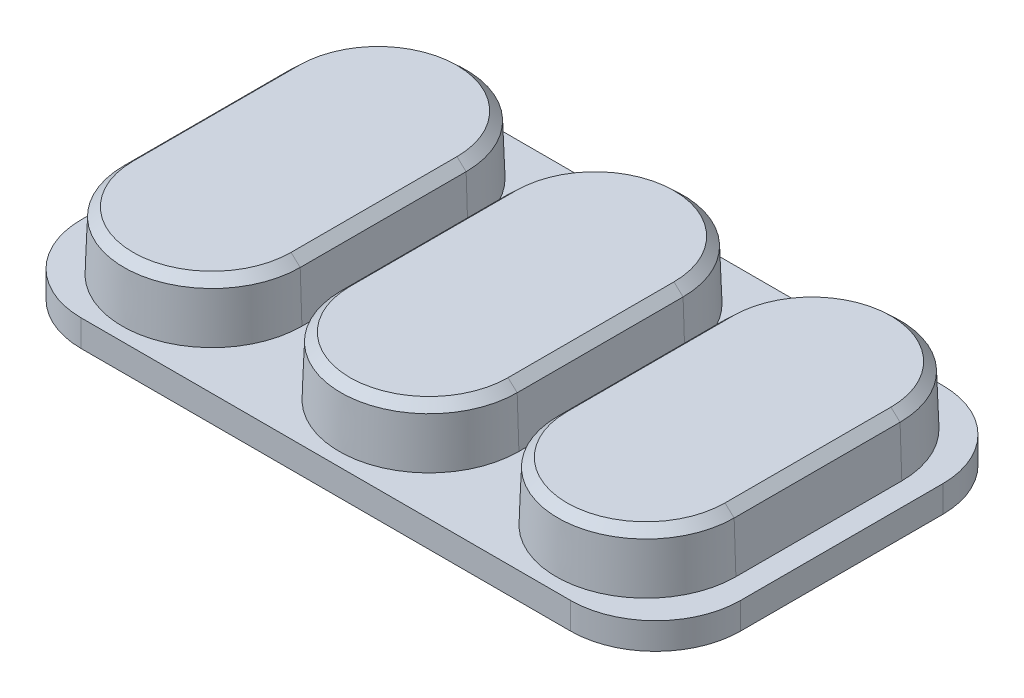
ISO-10303-21;
HEADER;
FILE_DESCRIPTION(('STEP AP214'),'2;1');
FILE_NAME('part.step','',(''),(''),'','','');
FILE_SCHEMA(('AUTOMOTIVE_DESIGN { 1 0 10303 214 1 1 1 1 }'));
ENDSEC;
DATA;
#1=APPLICATION_CONTEXT('core data for automotive mechanical design processes');
#2=APPLICATION_PROTOCOL_DEFINITION('international standard','automotive_design',2000,#1);
#3=PRODUCT_CONTEXT('',#1,'mechanical');
#4=PRODUCT('Part','Part','',(#3));
#5=PRODUCT_RELATED_PRODUCT_CATEGORY('part','',(#4));
#6=PRODUCT_DEFINITION_FORMATION('','',#4);
#7=PRODUCT_DEFINITION_CONTEXT('part definition',#1,'design');
#8=PRODUCT_DEFINITION('design','',#6,#7);
#9=PRODUCT_DEFINITION_SHAPE('','',#8);
#10=(LENGTH_UNIT() NAMED_UNIT(*) SI_UNIT(.MILLI.,.METRE.));
#11=(NAMED_UNIT(*) PLANE_ANGLE_UNIT() SI_UNIT($,.RADIAN.));
#12=(NAMED_UNIT(*) SI_UNIT($,.STERADIAN.) SOLID_ANGLE_UNIT());
#13=UNCERTAINTY_MEASURE_WITH_UNIT(LENGTH_MEASURE(1.E-05),#10,'distance_accuracy_value','');
#14=(GEOMETRIC_REPRESENTATION_CONTEXT(3) GLOBAL_UNCERTAINTY_ASSIGNED_CONTEXT((#13)) GLOBAL_UNIT_ASSIGNED_CONTEXT((#10,
#11,#12)) REPRESENTATION_CONTEXT('',''));
#15=CARTESIAN_POINT('',(0.,0.,0.));
#16=DIRECTION('',(0.,0.,1.));
#17=DIRECTION('',(1.,0.,0.));
#18=AXIS2_PLACEMENT_3D('',#15,#16,#17);
#19=CARTESIAN_POINT('',(23.,2.5,-9.50000000000001));
#20=DIRECTION('',(0.,-1.,0.));
#21=DIRECTION('',(0.,0.,-1.));
#22=AXIS2_PLACEMENT_3D('',#19,#20,#21);
#23=PLANE('',#22);
#24=CARTESIAN_POINT('',(0.,2.5,7.8));
#25=DIRECTION('',(0.,1.,0.));
#26=DIRECTION('',(0.,0.,1.));
#27=AXIS2_PLACEMENT_3D('',#24,#25,#26);
#28=CIRCLE('',#27,8.45);
#29=CARTESIAN_POINT('',(-8.45,2.5,7.8));
#30=VERTEX_POINT('',#29);
#31=CARTESIAN_POINT('',(8.45,2.5,7.8));
#32=VERTEX_POINT('',#31);
#33=EDGE_CURVE('E221',#30,#32,#28,.T.);
#34=ORIENTED_EDGE('',*,*,#33,.F.);
#35=DIRECTION('',(0.,0.,1.));
#36=VECTOR('',#35,1.);
#37=CARTESIAN_POINT('',(-8.45,2.5,7.8));
#38=LINE('',#37,#36);
#39=CARTESIAN_POINT('',(-8.45,2.5,-7.8));
#40=VERTEX_POINT('',#39);
#41=EDGE_CURVE('E680',#40,#30,#38,.T.);
#42=ORIENTED_EDGE('',*,*,#41,.F.);
#43=CARTESIAN_POINT('',(0.,2.5,-7.8));
#44=DIRECTION('',(0.,1.,0.));
#45=DIRECTION('',(0.,0.,1.));
#46=AXIS2_PLACEMENT_3D('',#43,#44,#45);
#47=CIRCLE('',#46,8.45);
#48=CARTESIAN_POINT('',(8.45,2.5,-7.8));
#49=VERTEX_POINT('',#48);
#50=EDGE_CURVE('E673',#49,#40,#47,.T.);
#51=ORIENTED_EDGE('',*,*,#50,.F.);
#52=DIRECTION('',(0.,0.,-1.));
#53=VECTOR('',#52,1.);
#54=CARTESIAN_POINT('',(8.45,2.5,7.8));
#55=LINE('',#54,#53);
#56=EDGE_CURVE('E678',#32,#49,#55,.T.);
#57=ORIENTED_EDGE('',*,*,#56,.F.);
#58=EDGE_LOOP('',(#34,#42,#51,#57));
#59=FACE_BOUND('',#58,.T.);
#60=CARTESIAN_POINT('',(23.,2.5,-9.50000000000001));
#61=DIRECTION('',(0.,1.,0.));
#62=DIRECTION('',(0.,0.,-1.));
#63=AXIS2_PLACEMENT_3D('',#60,#61,#62);
#64=CIRCLE('',#63,8.);
#65=CARTESIAN_POINT('',(31.,2.5,-9.49999999999995));
#66=VERTEX_POINT('',#65);
#67=CARTESIAN_POINT('',(23.,2.5,-17.5));
#68=VERTEX_POINT('',#67);
#69=EDGE_CURVE('E696',#66,#68,#64,.T.);
#70=ORIENTED_EDGE('',*,*,#69,.T.);
#71=DIRECTION('',(-1.,0.,0.));
#72=VECTOR('',#71,1.);
#73=CARTESIAN_POINT('',(-22.9999999999999,2.5,-17.5));
#74=LINE('',#73,#72);
#75=CARTESIAN_POINT('',(-22.9999999999999,2.5,-17.5));
#76=VERTEX_POINT('',#75);
#77=EDGE_CURVE('E699',#68,#76,#74,.T.);
#78=ORIENTED_EDGE('',*,*,#77,.T.);
#79=CARTESIAN_POINT('',(-23.,2.5,-9.5));
#80=DIRECTION('',(0.,1.,0.));
#81=DIRECTION('',(0.,0.,1.));
#82=AXIS2_PLACEMENT_3D('',#79,#80,#81);
#83=CIRCLE('',#82,8.);
#84=CARTESIAN_POINT('',(-31.,2.5,-9.49999999999995));
#85=VERTEX_POINT('',#84);
#86=EDGE_CURVE('E702',#76,#85,#83,.T.);
#87=ORIENTED_EDGE('',*,*,#86,.T.);
#88=DIRECTION('',(0.,0.,1.));
#89=VECTOR('',#88,1.);
#90=CARTESIAN_POINT('',(-31.,2.5,-9.49999999999994));
#91=LINE('',#90,#89);
#92=CARTESIAN_POINT('',(-31.,2.5,9.49999999999994));
#93=VERTEX_POINT('',#92);
#94=EDGE_CURVE('E704',#85,#93,#91,.T.);
#95=ORIENTED_EDGE('',*,*,#94,.T.);
#96=CARTESIAN_POINT('',(-23.,2.5,9.5));
#97=DIRECTION('',(0.,1.,0.));
#98=DIRECTION('',(0.,0.,1.));
#99=AXIS2_PLACEMENT_3D('',#96,#97,#98);
#100=CIRCLE('',#99,8.);
#101=CARTESIAN_POINT('',(-23.,2.5,17.5));
#102=VERTEX_POINT('',#101);
#103=EDGE_CURVE('E706',#93,#102,#100,.T.);
#104=ORIENTED_EDGE('',*,*,#103,.T.);
#105=DIRECTION('',(1.,0.,0.));
#106=VECTOR('',#105,1.);
#107=CARTESIAN_POINT('',(-22.9999999999999,2.5,17.5));
#108=LINE('',#107,#106);
#109=CARTESIAN_POINT('',(23.,2.5,17.5));
#110=VERTEX_POINT('',#109);
#111=EDGE_CURVE('E708',#102,#110,#108,.T.);
#112=ORIENTED_EDGE('',*,*,#111,.T.);
#113=CARTESIAN_POINT('',(23.,2.5,9.5));
#114=DIRECTION('',(0.,1.,0.));
#115=DIRECTION('',(0.,0.,1.));
#116=AXIS2_PLACEMENT_3D('',#113,#114,#115);
#117=CIRCLE('',#116,8.);
#118=CARTESIAN_POINT('',(31.,2.5,9.49999999999995));
#119=VERTEX_POINT('',#118);
#120=EDGE_CURVE('E710',#110,#119,#117,.T.);
#121=ORIENTED_EDGE('',*,*,#120,.T.);
#122=DIRECTION('',(0.,0.,-1.));
#123=VECTOR('',#122,1.);
#124=CARTESIAN_POINT('',(31.,2.5,-9.49999999999995));
#125=LINE('',#124,#123);
#126=EDGE_CURVE('E712',#119,#66,#125,.T.);
#127=ORIENTED_EDGE('',*,*,#126,.T.);
#128=EDGE_LOOP('',(#70,#78,#87,#95,#104,#112,#121,#127));
#129=FACE_BOUND('',#128,.T.);
#130=CARTESIAN_POINT('',(-20.4,2.5,7.8));
#131=DIRECTION('',(0.,1.,0.));
#132=DIRECTION('',(0.,0.,1.));
#133=AXIS2_PLACEMENT_3D('',#130,#131,#132);
#134=CIRCLE('',#133,8.45);
#135=CARTESIAN_POINT('',(-28.85,2.5,7.8));
#136=VERTEX_POINT('',#135);
#137=CARTESIAN_POINT('',(-11.95,2.5,7.8));
#138=VERTEX_POINT('',#137);
#139=EDGE_CURVE('E686',#136,#138,#134,.T.);
#140=ORIENTED_EDGE('',*,*,#139,.F.);
#141=DIRECTION('',(0.,0.,1.));
#142=VECTOR('',#141,1.);
#143=CARTESIAN_POINT('',(-28.85,2.5,7.8));
#144=LINE('',#143,#142);
#145=CARTESIAN_POINT('',(-28.85,2.5,-7.8));
#146=VERTEX_POINT('',#145);
#147=EDGE_CURVE('E693',#146,#136,#144,.T.);
#148=ORIENTED_EDGE('',*,*,#147,.F.);
#149=CARTESIAN_POINT('',(-20.4,2.5,-7.8));
#150=DIRECTION('',(0.,1.,0.));
#151=DIRECTION('',(0.,0.,1.));
#152=AXIS2_PLACEMENT_3D('',#149,#150,#151);
#153=CIRCLE('',#152,8.45);
#154=CARTESIAN_POINT('',(-11.95,2.5,-7.8));
#155=VERTEX_POINT('',#154);
#156=EDGE_CURVE('E652',#155,#146,#153,.T.);
#157=ORIENTED_EDGE('',*,*,#156,.F.);
#158=DIRECTION('',(0.,0.,-1.));
#159=VECTOR('',#158,1.);
#160=CARTESIAN_POINT('',(-11.95,2.5,7.8));
#161=LINE('',#160,#159);
#162=EDGE_CURVE('E689',#138,#155,#161,.T.);
#163=ORIENTED_EDGE('',*,*,#162,.F.);
#164=EDGE_LOOP('',(#140,#148,#157,#163));
#165=FACE_BOUND('',#164,.T.);
#166=CARTESIAN_POINT('',(20.4,2.5,7.8));
#167=DIRECTION('',(0.,1.,0.));
#168=DIRECTION('',(0.,0.,1.));
#169=AXIS2_PLACEMENT_3D('',#166,#167,#168);
#170=CIRCLE('',#169,8.45);
#171=CARTESIAN_POINT('',(11.95,2.5,7.8));
#172=VERTEX_POINT('',#171);
#173=CARTESIAN_POINT('',(28.85,2.5,7.8));
#174=VERTEX_POINT('',#173);
#175=EDGE_CURVE('E208',#172,#174,#170,.T.);
#176=ORIENTED_EDGE('',*,*,#175,.F.);
#177=DIRECTION('',(0.,0.,1.));
#178=VECTOR('',#177,1.);
#179=CARTESIAN_POINT('',(11.95,2.5,7.8));
#180=LINE('',#179,#178);
#181=CARTESIAN_POINT('',(11.95,2.5,-7.8));
#182=VERTEX_POINT('',#181);
#183=EDGE_CURVE('E211',#182,#172,#180,.T.);
#184=ORIENTED_EDGE('',*,*,#183,.F.);
#185=CARTESIAN_POINT('',(20.4,2.5,-7.8));
#186=DIRECTION('',(0.,1.,0.));
#187=DIRECTION('',(0.,0.,1.));
#188=AXIS2_PLACEMENT_3D('',#185,#186,#187);
#189=CIRCLE('',#188,8.45);
#190=CARTESIAN_POINT('',(28.85,2.5,-7.8));
#191=VERTEX_POINT('',#190);
#192=EDGE_CURVE('E222',#191,#182,#189,.T.);
#193=ORIENTED_EDGE('',*,*,#192,.F.);
#194=DIRECTION('',(0.,0.,-1.));
#195=VECTOR('',#194,1.);
#196=CARTESIAN_POINT('',(28.85,2.5,7.8));
#197=LINE('',#196,#195);
#198=EDGE_CURVE('E213',#174,#191,#197,.T.);
#199=ORIENTED_EDGE('',*,*,#198,.F.);
#200=EDGE_LOOP('',(#176,#184,#193,#199));
#201=FACE_BOUND('',#200,.T.);
#202=ADVANCED_FACE('F33',(#59,#129,#165,#201),#23,.F.);
#203=CARTESIAN_POINT('',(23.,2.5,-9.50000000000001));
#204=DIRECTION('',(0.,-1.,0.));
#205=DIRECTION('',(0.,0.,-1.));
#206=AXIS2_PLACEMENT_3D('',#203,#204,#205);
#207=CYLINDRICAL_SURFACE('',#206,8.);
#208=CARTESIAN_POINT('',(23.,0.,-9.50000000000001));
#209=DIRECTION('',(0.,1.,0.));
#210=DIRECTION('',(0.,0.,-1.));
#211=AXIS2_PLACEMENT_3D('',#208,#209,#210);
#212=CIRCLE('',#211,8.);
#213=CARTESIAN_POINT('',(31.,0.,-9.49999999999995));
#214=VERTEX_POINT('',#213);
#215=CARTESIAN_POINT('',(23.,0.,-17.5));
#216=VERTEX_POINT('',#215);
#217=EDGE_CURVE('E695',#214,#216,#212,.T.);
#218=ORIENTED_EDGE('',*,*,#217,.T.);
#219=DIRECTION('',(0.,-1.,0.));
#220=VECTOR('',#219,1.);
#221=CARTESIAN_POINT('',(23.,2.5,-17.5));
#222=LINE('',#221,#220);
#223=EDGE_CURVE('E243',#68,#216,#222,.T.);
#224=ORIENTED_EDGE('',*,*,#223,.F.);
#225=ORIENTED_EDGE('',*,*,#69,.F.);
#226=DIRECTION('',(0.,-1.,0.));
#227=VECTOR('',#226,1.);
#228=CARTESIAN_POINT('',(31.,2.5,-9.49999999999995));
#229=LINE('',#228,#227);
#230=EDGE_CURVE('E714',#66,#214,#229,.T.);
#231=ORIENTED_EDGE('',*,*,#230,.T.);
#232=EDGE_LOOP('',(#218,#224,#225,#231));
#233=FACE_BOUND('',#232,.T.);
#234=ADVANCED_FACE('F352',(#233),#207,.T.);
#235=CARTESIAN_POINT('',(-22.9999999999999,2.5,-17.5));
#236=DIRECTION('',(0.,0.,1.));
#237=DIRECTION('',(1.,0.,0.));
#238=AXIS2_PLACEMENT_3D('',#235,#236,#237);
#239=PLANE('',#238);
#240=DIRECTION('',(-1.,0.,0.));
#241=VECTOR('',#240,1.);
#242=CARTESIAN_POINT('',(-22.9999999999999,0.,-17.5));
#243=LINE('',#242,#241);
#244=CARTESIAN_POINT('',(-22.9999999999999,0.,-17.5));
#245=VERTEX_POINT('',#244);
#246=EDGE_CURVE('E717',#216,#245,#243,.T.);
#247=ORIENTED_EDGE('',*,*,#246,.T.);
#248=DIRECTION('',(0.,-1.,0.));
#249=VECTOR('',#248,1.);
#250=CARTESIAN_POINT('',(-22.9999999999999,2.5,-17.5));
#251=LINE('',#250,#249);
#252=EDGE_CURVE('E747',#76,#245,#251,.T.);
#253=ORIENTED_EDGE('',*,*,#252,.F.);
#254=ORIENTED_EDGE('',*,*,#77,.F.);
#255=ORIENTED_EDGE('',*,*,#223,.T.);
#256=EDGE_LOOP('',(#247,#253,#254,#255));
#257=FACE_BOUND('',#256,.T.);
#258=ADVANCED_FACE('F358',(#257),#239,.F.);
#259=CARTESIAN_POINT('',(-23.,2.5,-9.5));
#260=DIRECTION('',(0.,-1.,0.));
#261=DIRECTION('',(0.,0.,-1.));
#262=AXIS2_PLACEMENT_3D('',#259,#260,#261);
#263=CYLINDRICAL_SURFACE('',#262,8.);
#264=CARTESIAN_POINT('',(-23.,0.,-9.5));
#265=DIRECTION('',(0.,1.,0.));
#266=DIRECTION('',(0.,0.,1.));
#267=AXIS2_PLACEMENT_3D('',#264,#265,#266);
#268=CIRCLE('',#267,8.);
#269=CARTESIAN_POINT('',(-31.,0.,-9.49999999999995));
#270=VERTEX_POINT('',#269);
#271=EDGE_CURVE('E719',#245,#270,#268,.T.);
#272=ORIENTED_EDGE('',*,*,#271,.T.);
#273=DIRECTION('',(0.,-1.,0.));
#274=VECTOR('',#273,1.);
#275=CARTESIAN_POINT('',(-31.,2.5,-9.49999999999995));
#276=LINE('',#275,#274);
#277=EDGE_CURVE('E744',#85,#270,#276,.T.);
#278=ORIENTED_EDGE('',*,*,#277,.F.);
#279=ORIENTED_EDGE('',*,*,#86,.F.);
#280=ORIENTED_EDGE('',*,*,#252,.T.);
#281=EDGE_LOOP('',(#272,#278,#279,#280));
#282=FACE_BOUND('',#281,.T.);
#283=ADVANCED_FACE('F387',(#282),#263,.T.);
#284=CARTESIAN_POINT('',(-31.,2.5,-9.49999999999994));
#285=DIRECTION('',(1.,0.,0.));
#286=DIRECTION('',(0.,0.,-1.));
#287=AXIS2_PLACEMENT_3D('',#284,#285,#286);
#288=PLANE('',#287);
#289=DIRECTION('',(0.,0.,1.));
#290=VECTOR('',#289,1.);
#291=CARTESIAN_POINT('',(-31.,0.,-9.49999999999994));
#292=LINE('',#291,#290);
#293=CARTESIAN_POINT('',(-31.,0.,9.49999999999994));
#294=VERTEX_POINT('',#293);
#295=EDGE_CURVE('E721',#270,#294,#292,.T.);
#296=ORIENTED_EDGE('',*,*,#295,.T.);
#297=DIRECTION('',(0.,-1.,0.));
#298=VECTOR('',#297,1.);
#299=CARTESIAN_POINT('',(-31.,2.5,9.49999999999994));
#300=LINE('',#299,#298);
#301=EDGE_CURVE('E741',#93,#294,#300,.T.);
#302=ORIENTED_EDGE('',*,*,#301,.F.);
#303=ORIENTED_EDGE('',*,*,#94,.F.);
#304=ORIENTED_EDGE('',*,*,#277,.T.);
#305=EDGE_LOOP('',(#296,#302,#303,#304));
#306=FACE_BOUND('',#305,.T.);
#307=ADVANCED_FACE('F383',(#306),#288,.F.);
#308=CARTESIAN_POINT('',(-23.,2.5,9.5));
#309=DIRECTION('',(0.,-1.,0.));
#310=DIRECTION('',(0.,0.,-1.));
#311=AXIS2_PLACEMENT_3D('',#308,#309,#310);
#312=CYLINDRICAL_SURFACE('',#311,8.);
#313=CARTESIAN_POINT('',(-23.,0.,9.5));
#314=DIRECTION('',(0.,1.,0.));
#315=DIRECTION('',(0.,0.,1.));
#316=AXIS2_PLACEMENT_3D('',#313,#314,#315);
#317=CIRCLE('',#316,8.);
#318=CARTESIAN_POINT('',(-23.,0.,17.5));
#319=VERTEX_POINT('',#318);
#320=EDGE_CURVE('E723',#294,#319,#317,.T.);
#321=ORIENTED_EDGE('',*,*,#320,.T.);
#322=DIRECTION('',(0.,-1.,0.));
#323=VECTOR('',#322,1.);
#324=CARTESIAN_POINT('',(-23.,2.5,17.5));
#325=LINE('',#324,#323);
#326=EDGE_CURVE('E738',#102,#319,#325,.T.);
#327=ORIENTED_EDGE('',*,*,#326,.F.);
#328=ORIENTED_EDGE('',*,*,#103,.F.);
#329=ORIENTED_EDGE('',*,*,#301,.T.);
#330=EDGE_LOOP('',(#321,#327,#328,#329));
#331=FACE_BOUND('',#330,.T.);
#332=ADVANCED_FACE('F379',(#331),#312,.T.);
#333=CARTESIAN_POINT('',(-22.9999999999999,2.5,17.5));
#334=DIRECTION('',(0.,0.,-1.));
#335=DIRECTION('',(-1.,0.,0.));
#336=AXIS2_PLACEMENT_3D('',#333,#334,#335);
#337=PLANE('',#336);
#338=DIRECTION('',(1.,0.,0.));
#339=VECTOR('',#338,1.);
#340=CARTESIAN_POINT('',(-22.9999999999999,0.,17.5));
#341=LINE('',#340,#339);
#342=CARTESIAN_POINT('',(23.,0.,17.5));
#343=VERTEX_POINT('',#342);
#344=EDGE_CURVE('E725',#319,#343,#341,.T.);
#345=ORIENTED_EDGE('',*,*,#344,.T.);
#346=DIRECTION('',(0.,-1.,0.));
#347=VECTOR('',#346,1.);
#348=CARTESIAN_POINT('',(23.,2.5,17.5));
#349=LINE('',#348,#347);
#350=EDGE_CURVE('E735',#110,#343,#349,.T.);
#351=ORIENTED_EDGE('',*,*,#350,.F.);
#352=ORIENTED_EDGE('',*,*,#111,.F.);
#353=ORIENTED_EDGE('',*,*,#326,.T.);
#354=EDGE_LOOP('',(#345,#351,#352,#353));
#355=FACE_BOUND('',#354,.T.);
#356=ADVANCED_FACE('F375',(#355),#337,.F.);
#357=CARTESIAN_POINT('',(23.,2.5,9.5));
#358=DIRECTION('',(0.,-1.,0.));
#359=DIRECTION('',(0.,0.,-1.));
#360=AXIS2_PLACEMENT_3D('',#357,#358,#359);
#361=CYLINDRICAL_SURFACE('',#360,8.);
#362=CARTESIAN_POINT('',(23.,0.,9.5));
#363=DIRECTION('',(0.,1.,0.));
#364=DIRECTION('',(0.,0.,1.));
#365=AXIS2_PLACEMENT_3D('',#362,#363,#364);
#366=CIRCLE('',#365,8.);
#367=CARTESIAN_POINT('',(31.,0.,9.49999999999995));
#368=VERTEX_POINT('',#367);
#369=EDGE_CURVE('E727',#343,#368,#366,.T.);
#370=ORIENTED_EDGE('',*,*,#369,.T.);
#371=DIRECTION('',(0.,-1.,0.));
#372=VECTOR('',#371,1.);
#373=CARTESIAN_POINT('',(31.,2.5,9.49999999999995));
#374=LINE('',#373,#372);
#375=EDGE_CURVE('E732',#119,#368,#374,.T.);
#376=ORIENTED_EDGE('',*,*,#375,.F.);
#377=ORIENTED_EDGE('',*,*,#120,.F.);
#378=ORIENTED_EDGE('',*,*,#350,.T.);
#379=EDGE_LOOP('',(#370,#376,#377,#378));
#380=FACE_BOUND('',#379,.T.);
#381=ADVANCED_FACE('F371',(#380),#361,.T.);
#382=CARTESIAN_POINT('',(31.,2.5,-9.49999999999995));
#383=DIRECTION('',(-1.,0.,0.));
#384=DIRECTION('',(0.,0.,1.));
#385=AXIS2_PLACEMENT_3D('',#382,#383,#384);
#386=PLANE('',#385);
#387=DIRECTION('',(0.,0.,-1.));
#388=VECTOR('',#387,1.);
#389=CARTESIAN_POINT('',(31.,0.,-9.49999999999995));
#390=LINE('',#389,#388);
#391=EDGE_CURVE('E700',#368,#214,#390,.T.);
#392=ORIENTED_EDGE('',*,*,#391,.T.);
#393=ORIENTED_EDGE('',*,*,#230,.F.);
#394=ORIENTED_EDGE('',*,*,#126,.F.);
#395=ORIENTED_EDGE('',*,*,#375,.T.);
#396=EDGE_LOOP('',(#392,#393,#394,#395));
#397=FACE_BOUND('',#396,.T.);
#398=ADVANCED_FACE('F367',(#397),#386,.F.);
#399=CARTESIAN_POINT('',(23.,0.,-9.50000000000001));
#400=DIRECTION('',(0.,-1.,0.));
#401=DIRECTION('',(0.,0.,-1.));
#402=AXIS2_PLACEMENT_3D('',#399,#400,#401);
#403=PLANE('',#402);
#404=ORIENTED_EDGE('',*,*,#217,.F.);
#405=ORIENTED_EDGE('',*,*,#391,.F.);
#406=ORIENTED_EDGE('',*,*,#369,.F.);
#407=ORIENTED_EDGE('',*,*,#344,.F.);
#408=ORIENTED_EDGE('',*,*,#320,.F.);
#409=ORIENTED_EDGE('',*,*,#295,.F.);
#410=ORIENTED_EDGE('',*,*,#271,.F.);
#411=ORIENTED_EDGE('',*,*,#246,.F.);
#412=EDGE_LOOP('',(#404,#405,#406,#407,#408,#409,#410,#411));
#413=FACE_BOUND('',#412,.T.);
#414=ADVANCED_FACE('F364',(#413),#403,.T.);
#415=CARTESIAN_POINT('',(-20.4,8.,7.8));
#416=DIRECTION('',(0.,1.,0.));
#417=DIRECTION('',(0.,0.,1.));
#418=AXIS2_PLACEMENT_3D('',#415,#416,#417);
#419=PLANE('',#418);
#420=CARTESIAN_POINT('',(-20.4,8.,7.8));
#421=DIRECTION('',(0.,1.,0.));
#422=DIRECTION('',(0.,0.,1.));
#423=AXIS2_PLACEMENT_3D('',#420,#421,#422);
#424=CIRCLE('',#423,7.42848300357264);
#425=CARTESIAN_POINT('',(-27.8284830035726,8.,7.8));
#426=VERTEX_POINT('',#425);
#427=CARTESIAN_POINT('',(-12.9715169964274,8.,7.8));
#428=VERTEX_POINT('',#427);
#429=EDGE_CURVE('E245',#426,#428,#424,.T.);
#430=ORIENTED_EDGE('',*,*,#429,.T.);
#431=DIRECTION('',(0.,0.,-1.));
#432=VECTOR('',#431,1.);
#433=CARTESIAN_POINT('',(-12.9715169964274,8.,7.8));
#434=LINE('',#433,#432);
#435=CARTESIAN_POINT('',(-12.9715169964274,8.,-7.8));
#436=VERTEX_POINT('',#435);
#437=EDGE_CURVE('E247',#428,#436,#434,.T.);
#438=ORIENTED_EDGE('',*,*,#437,.T.);
#439=CARTESIAN_POINT('',(-20.4,8.,-7.8));
#440=DIRECTION('',(0.,1.,0.));
#441=DIRECTION('',(0.,0.,1.));
#442=AXIS2_PLACEMENT_3D('',#439,#440,#441);
#443=CIRCLE('',#442,7.42848300357264);
#444=CARTESIAN_POINT('',(-27.8284830035726,8.,-7.8));
#445=VERTEX_POINT('',#444);
#446=EDGE_CURVE('E240',#436,#445,#443,.T.);
#447=ORIENTED_EDGE('',*,*,#446,.T.);
#448=DIRECTION('',(0.,0.,1.));
#449=VECTOR('',#448,1.);
#450=CARTESIAN_POINT('',(-27.8284830035726,8.,7.8));
#451=LINE('',#450,#449);
#452=EDGE_CURVE('E242',#445,#426,#451,.T.);
#453=ORIENTED_EDGE('',*,*,#452,.T.);
#454=EDGE_LOOP('',(#430,#438,#447,#453));
#455=FACE_BOUND('',#454,.T.);
#456=ADVANCED_FACE('F348',(#455),#419,.T.);
#457=CARTESIAN_POINT('',(0.,8.,7.8));
#458=DIRECTION('',(0.,1.,0.));
#459=DIRECTION('',(0.,0.,1.));
#460=AXIS2_PLACEMENT_3D('',#457,#458,#459);
#461=PLANE('',#460);
#462=CARTESIAN_POINT('',(0.,8.,7.8));
#463=DIRECTION('',(0.,1.,0.));
#464=DIRECTION('',(0.,0.,1.));
#465=AXIS2_PLACEMENT_3D('',#462,#463,#464);
#466=CIRCLE('',#465,7.42848300357264);
#467=CARTESIAN_POINT('',(-7.42848300357264,8.,7.8));
#468=VERTEX_POINT('',#467);
#469=CARTESIAN_POINT('',(7.42848300357264,8.,7.8));
#470=VERTEX_POINT('',#469);
#471=EDGE_CURVE('E263',#468,#470,#466,.T.);
#472=ORIENTED_EDGE('',*,*,#471,.T.);
#473=DIRECTION('',(0.,0.,-1.));
#474=VECTOR('',#473,1.);
#475=CARTESIAN_POINT('',(7.42848300357264,8.,7.8));
#476=LINE('',#475,#474);
#477=CARTESIAN_POINT('',(7.42848300357264,8.,-7.8));
#478=VERTEX_POINT('',#477);
#479=EDGE_CURVE('E265',#470,#478,#476,.T.);
#480=ORIENTED_EDGE('',*,*,#479,.T.);
#481=CARTESIAN_POINT('',(0.,8.,-7.8));
#482=DIRECTION('',(0.,1.,0.));
#483=DIRECTION('',(0.,0.,1.));
#484=AXIS2_PLACEMENT_3D('',#481,#482,#483);
#485=CIRCLE('',#484,7.42848300357264);
#486=CARTESIAN_POINT('',(-7.42848300357264,8.,-7.8));
#487=VERTEX_POINT('',#486);
#488=EDGE_CURVE('E259',#478,#487,#485,.T.);
#489=ORIENTED_EDGE('',*,*,#488,.T.);
#490=DIRECTION('',(0.,0.,1.));
#491=VECTOR('',#490,1.);
#492=CARTESIAN_POINT('',(-7.42848300357264,8.,7.8));
#493=LINE('',#492,#491);
#494=EDGE_CURVE('E261',#487,#468,#493,.T.);
#495=ORIENTED_EDGE('',*,*,#494,.T.);
#496=EDGE_LOOP('',(#472,#480,#489,#495));
#497=FACE_BOUND('',#496,.T.);
#498=ADVANCED_FACE('F339',(#497),#461,.T.);
#499=CARTESIAN_POINT('',(20.4,8.,7.8));
#500=DIRECTION('',(0.,1.,0.));
#501=DIRECTION('',(0.,0.,1.));
#502=AXIS2_PLACEMENT_3D('',#499,#500,#501);
#503=PLANE('',#502);
#504=CARTESIAN_POINT('',(20.4,8.,7.8));
#505=DIRECTION('',(0.,1.,0.));
#506=DIRECTION('',(0.,0.,1.));
#507=AXIS2_PLACEMENT_3D('',#504,#505,#506);
#508=CIRCLE('',#507,7.42848300357264);
#509=CARTESIAN_POINT('',(12.9715169964274,8.,7.8));
#510=VERTEX_POINT('',#509);
#511=CARTESIAN_POINT('',(27.8284830035726,8.,7.8));
#512=VERTEX_POINT('',#511);
#513=EDGE_CURVE('E281',#510,#512,#508,.T.);
#514=ORIENTED_EDGE('',*,*,#513,.T.);
#515=DIRECTION('',(0.,0.,-1.));
#516=VECTOR('',#515,1.);
#517=CARTESIAN_POINT('',(27.8284830035726,8.,7.8));
#518=LINE('',#517,#516);
#519=CARTESIAN_POINT('',(27.8284830035726,8.,-7.8));
#520=VERTEX_POINT('',#519);
#521=EDGE_CURVE('E283',#512,#520,#518,.T.);
#522=ORIENTED_EDGE('',*,*,#521,.T.);
#523=CARTESIAN_POINT('',(20.4,8.,-7.8));
#524=DIRECTION('',(0.,1.,0.));
#525=DIRECTION('',(0.,0.,1.));
#526=AXIS2_PLACEMENT_3D('',#523,#524,#525);
#527=CIRCLE('',#526,7.42848300357264);
#528=CARTESIAN_POINT('',(12.9715169964274,8.,-7.8));
#529=VERTEX_POINT('',#528);
#530=EDGE_CURVE('E277',#520,#529,#527,.T.);
#531=ORIENTED_EDGE('',*,*,#530,.T.);
#532=DIRECTION('',(0.,0.,1.));
#533=VECTOR('',#532,1.);
#534=CARTESIAN_POINT('',(12.9715169964274,8.,7.8));
#535=LINE('',#534,#533);
#536=EDGE_CURVE('E279',#529,#510,#535,.T.);
#537=ORIENTED_EDGE('',*,*,#536,.T.);
#538=EDGE_LOOP('',(#514,#522,#531,#537));
#539=FACE_BOUND('',#538,.T.);
#540=ADVANCED_FACE('F336',(#539),#503,.T.);
#541=CARTESIAN_POINT('',(-12.1420642322046,8.,7.8));
#542=DIRECTION('',(0.999390827019096,0.0348994967024976,0.));
#543=DIRECTION('',(0.,0.,1.));
#544=AXIS2_PLACEMENT_3D('',#541,#542,#543);
#545=PLANE('',#544);
#546=DIRECTION('',(0.0348994967024976,-0.999390827019096,0.));
#547=VECTOR('',#546,1.);
#548=CARTESIAN_POINT('',(-12.1420642322046,8.,-7.8));
#549=LINE('',#548,#547);
#550=CARTESIAN_POINT('',(-12.1141446348426,7.20048733838474,-7.8));
#551=VERTEX_POINT('',#550);
#552=EDGE_CURVE('E215',#551,#155,#549,.T.);
#553=ORIENTED_EDGE('',*,*,#552,.F.);
#554=DIRECTION('',(0.,0.,1.));
#555=VECTOR('',#554,1.);
#556=CARTESIAN_POINT('',(-12.1141446348426,7.20048733838472,7.8));
#557=LINE('',#556,#555);
#558=CARTESIAN_POINT('',(-12.1141446348426,7.20048733838474,7.8));
#559=VERTEX_POINT('',#558);
#560=EDGE_CURVE('E250',#551,#559,#557,.T.);
#561=ORIENTED_EDGE('',*,*,#560,.T.);
#562=DIRECTION('',(-0.0348994967024976,0.999390827019096,0.));
#563=VECTOR('',#562,1.);
#564=CARTESIAN_POINT('',(-11.95,2.49999999999998,7.8));
#565=LINE('',#564,#563);
#566=EDGE_CURVE('E654',#138,#559,#565,.T.);
#567=ORIENTED_EDGE('',*,*,#566,.F.);
#568=ORIENTED_EDGE('',*,*,#162,.T.);
#569=EDGE_LOOP('',(#553,#561,#567,#568));
#570=FACE_BOUND('',#569,.T.);
#571=ADVANCED_FACE('F338',(#570),#545,.T.);
#572=CARTESIAN_POINT('',(-20.4,8.,-7.8));
#573=DIRECTION('',(0.,-1.,0.));
#574=DIRECTION('',(0.,0.,-1.));
#575=AXIS2_PLACEMENT_3D('',#572,#573,#574);
#576=CONICAL_SURFACE('',#575,8.2579357677954,0.0349065850398832);
#577=DIRECTION('',(-0.0348994967024976,-0.999390827019096,0.));
#578=VECTOR('',#577,1.);
#579=CARTESIAN_POINT('',(-28.6579357677954,8.,-7.8));
#580=LINE('',#579,#578);
#581=CARTESIAN_POINT('',(-28.6858553651574,7.20048733838474,-7.8));
#582=VERTEX_POINT('',#581);
#583=EDGE_CURVE('E646',#582,#146,#580,.T.);
#584=ORIENTED_EDGE('',*,*,#583,.F.);
#585=CARTESIAN_POINT('',(-20.4,7.20048733838474,-7.8));
#586=DIRECTION('',(0.,1.,0.));
#587=DIRECTION('',(0.,0.,1.));
#588=AXIS2_PLACEMENT_3D('',#585,#586,#587);
#589=CIRCLE('',#588,8.2858553651574);
#590=EDGE_CURVE('E257',#582,#551,#589,.F.);
#591=ORIENTED_EDGE('',*,*,#590,.T.);
#592=ORIENTED_EDGE('',*,*,#552,.T.);
#593=ORIENTED_EDGE('',*,*,#156,.T.);
#594=EDGE_LOOP('',(#584,#591,#592,#593));
#595=FACE_BOUND('',#594,.T.);
#596=ADVANCED_FACE('F345',(#595),#576,.T.);
#597=CARTESIAN_POINT('',(-20.4,8.,7.8));
#598=DIRECTION('',(0.,-1.,0.));
#599=DIRECTION('',(0.,0.,-1.));
#600=AXIS2_PLACEMENT_3D('',#597,#598,#599);
#601=CONICAL_SURFACE('',#600,8.2579357677954,0.0349065850398832);
#602=ORIENTED_EDGE('',*,*,#566,.T.);
#603=CARTESIAN_POINT('',(-20.4,7.20048733838474,7.8));
#604=DIRECTION('',(0.,1.,0.));
#605=DIRECTION('',(0.,0.,1.));
#606=AXIS2_PLACEMENT_3D('',#603,#604,#605);
#607=CIRCLE('',#606,8.2858553651574);
#608=CARTESIAN_POINT('',(-28.6858553651574,7.20048733838472,7.8));
#609=VERTEX_POINT('',#608);
#610=EDGE_CURVE('E253',#559,#609,#607,.F.);
#611=ORIENTED_EDGE('',*,*,#610,.T.);
#612=DIRECTION('',(0.0348994967024976,0.999390827019096,0.));
#613=VECTOR('',#612,1.);
#614=CARTESIAN_POINT('',(-28.85,2.49999999999998,7.8));
#615=LINE('',#614,#613);
#616=EDGE_CURVE('E649',#136,#609,#615,.T.);
#617=ORIENTED_EDGE('',*,*,#616,.F.);
#618=ORIENTED_EDGE('',*,*,#139,.T.);
#619=EDGE_LOOP('',(#602,#611,#617,#618));
#620=FACE_BOUND('',#619,.T.);
#621=ADVANCED_FACE('F399',(#620),#601,.T.);
#622=CARTESIAN_POINT('',(-28.6579357677954,8.,7.8));
#623=DIRECTION('',(-0.999390827019096,0.0348994967024976,0.));
#624=DIRECTION('',(0.,0.,-1.));
#625=AXIS2_PLACEMENT_3D('',#622,#623,#624);
#626=PLANE('',#625);
#627=ORIENTED_EDGE('',*,*,#616,.T.);
#628=DIRECTION('',(0.,0.,-1.));
#629=VECTOR('',#628,1.);
#630=CARTESIAN_POINT('',(-28.6858553651574,7.20048733838472,7.8));
#631=LINE('',#630,#629);
#632=EDGE_CURVE('E255',#609,#582,#631,.T.);
#633=ORIENTED_EDGE('',*,*,#632,.T.);
#634=ORIENTED_EDGE('',*,*,#583,.T.);
#635=ORIENTED_EDGE('',*,*,#147,.T.);
#636=EDGE_LOOP('',(#627,#633,#634,#635));
#637=FACE_BOUND('',#636,.T.);
#638=ADVANCED_FACE('F395',(#637),#626,.T.);
#639=CARTESIAN_POINT('',(8.2579357677954,8.,7.8));
#640=DIRECTION('',(0.999390827019096,0.0348994967024976,0.));
#641=DIRECTION('',(0.,0.,1.));
#642=AXIS2_PLACEMENT_3D('',#639,#640,#641);
#643=PLANE('',#642);
#644=DIRECTION('',(0.0348994967024976,-0.999390827019096,0.));
#645=VECTOR('',#644,1.);
#646=CARTESIAN_POINT('',(8.2579357677954,8.,-7.8));
#647=LINE('',#646,#645);
#648=CARTESIAN_POINT('',(8.2858553651574,7.20048733838474,-7.8));
#649=VERTEX_POINT('',#648);
#650=EDGE_CURVE('E233',#649,#49,#647,.T.);
#651=ORIENTED_EDGE('',*,*,#650,.F.);
#652=DIRECTION('',(0.,0.,1.));
#653=VECTOR('',#652,1.);
#654=CARTESIAN_POINT('',(8.2858553651574,7.20048733838472,7.8));
#655=LINE('',#654,#653);
#656=CARTESIAN_POINT('',(8.2858553651574,7.20048733838474,7.8));
#657=VERTEX_POINT('',#656);
#658=EDGE_CURVE('E268',#649,#657,#655,.T.);
#659=ORIENTED_EDGE('',*,*,#658,.T.);
#660=DIRECTION('',(-0.0348994967024976,0.999390827019096,0.));
#661=VECTOR('',#660,1.);
#662=CARTESIAN_POINT('',(8.45,2.49999999999998,7.8));
#663=LINE('',#662,#661);
#664=EDGE_CURVE('E665',#32,#657,#663,.T.);
#665=ORIENTED_EDGE('',*,*,#664,.F.);
#666=ORIENTED_EDGE('',*,*,#56,.T.);
#667=EDGE_LOOP('',(#651,#659,#665,#666));
#668=FACE_BOUND('',#667,.T.);
#669=ADVANCED_FACE('F398',(#668),#643,.T.);
#670=CARTESIAN_POINT('',(0.,8.,-7.8));
#671=DIRECTION('',(0.,-1.,0.));
#672=DIRECTION('',(0.,0.,-1.));
#673=AXIS2_PLACEMENT_3D('',#670,#671,#672);
#674=CONICAL_SURFACE('',#673,8.2579357677954,0.0349065850398832);
#675=DIRECTION('',(-0.0348994967024976,-0.999390827019096,0.));
#676=VECTOR('',#675,1.);
#677=CARTESIAN_POINT('',(-8.2579357677954,8.,-7.8));
#678=LINE('',#677,#676);
#679=CARTESIAN_POINT('',(-8.2858553651574,7.20048733838474,-7.8));
#680=VERTEX_POINT('',#679);
#681=EDGE_CURVE('E664',#680,#40,#678,.T.);
#682=ORIENTED_EDGE('',*,*,#681,.F.);
#683=CARTESIAN_POINT('',(0.,7.20048733838474,-7.8));
#684=DIRECTION('',(0.,1.,0.));
#685=DIRECTION('',(0.,0.,1.));
#686=AXIS2_PLACEMENT_3D('',#683,#684,#685);
#687=CIRCLE('',#686,8.2858553651574);
#688=EDGE_CURVE('E275',#680,#649,#687,.F.);
#689=ORIENTED_EDGE('',*,*,#688,.T.);
#690=ORIENTED_EDGE('',*,*,#650,.T.);
#691=ORIENTED_EDGE('',*,*,#50,.T.);
#692=EDGE_LOOP('',(#682,#689,#690,#691));
#693=FACE_BOUND('',#692,.T.);
#694=ADVANCED_FACE('F414',(#693),#674,.T.);
#695=CARTESIAN_POINT('',(0.,8.,7.8));
#696=DIRECTION('',(0.,-1.,0.));
#697=DIRECTION('',(0.,0.,-1.));
#698=AXIS2_PLACEMENT_3D('',#695,#696,#697);
#699=CONICAL_SURFACE('',#698,8.2579357677954,0.0349065850398832);
#700=ORIENTED_EDGE('',*,*,#664,.T.);
#701=CARTESIAN_POINT('',(0.,7.20048733838474,7.8));
#702=DIRECTION('',(0.,1.,0.));
#703=DIRECTION('',(0.,0.,1.));
#704=AXIS2_PLACEMENT_3D('',#701,#702,#703);
#705=CIRCLE('',#704,8.2858553651574);
#706=CARTESIAN_POINT('',(-8.2858553651574,7.20048733838472,7.8));
#707=VERTEX_POINT('',#706);
#708=EDGE_CURVE('E271',#657,#707,#705,.F.);
#709=ORIENTED_EDGE('',*,*,#708,.T.);
#710=DIRECTION('',(0.0348994967024976,0.999390827019096,0.));
#711=VECTOR('',#710,1.);
#712=CARTESIAN_POINT('',(-8.45,2.49999999999998,7.8));
#713=LINE('',#712,#711);
#714=EDGE_CURVE('E239',#30,#707,#713,.T.);
#715=ORIENTED_EDGE('',*,*,#714,.F.);
#716=ORIENTED_EDGE('',*,*,#33,.T.);
#717=EDGE_LOOP('',(#700,#709,#715,#716));
#718=FACE_BOUND('',#717,.T.);
#719=ADVANCED_FACE('F410',(#718),#699,.T.);
#720=CARTESIAN_POINT('',(-8.2579357677954,8.,7.8));
#721=DIRECTION('',(-0.999390827019096,0.0348994967024976,0.));
#722=DIRECTION('',(0.,0.,-1.));
#723=AXIS2_PLACEMENT_3D('',#720,#721,#722);
#724=PLANE('',#723);
#725=ORIENTED_EDGE('',*,*,#714,.T.);
#726=DIRECTION('',(0.,0.,-1.));
#727=VECTOR('',#726,1.);
#728=CARTESIAN_POINT('',(-8.2858553651574,7.20048733838472,7.8));
#729=LINE('',#728,#727);
#730=EDGE_CURVE('E273',#707,#680,#729,.T.);
#731=ORIENTED_EDGE('',*,*,#730,.T.);
#732=ORIENTED_EDGE('',*,*,#681,.T.);
#733=ORIENTED_EDGE('',*,*,#41,.T.);
#734=EDGE_LOOP('',(#725,#731,#732,#733));
#735=FACE_BOUND('',#734,.T.);
#736=ADVANCED_FACE('F407',(#735),#724,.T.);
#737=CARTESIAN_POINT('',(28.6579357677954,8.,7.8));
#738=DIRECTION('',(0.999390827019096,0.0348994967024977,0.));
#739=DIRECTION('',(0.,0.,1.));
#740=AXIS2_PLACEMENT_3D('',#737,#738,#739);
#741=PLANE('',#740);
#742=DIRECTION('',(0.0348994967024977,-0.999390827019096,0.));
#743=VECTOR('',#742,1.);
#744=CARTESIAN_POINT('',(28.6579357677954,8.,-7.8));
#745=LINE('',#744,#743);
#746=CARTESIAN_POINT('',(28.6858553651574,7.20048733838474,-7.8));
#747=VERTEX_POINT('',#746);
#748=EDGE_CURVE('E237',#747,#191,#745,.T.);
#749=ORIENTED_EDGE('',*,*,#748,.F.);
#750=DIRECTION('',(0.,0.,1.));
#751=VECTOR('',#750,1.);
#752=CARTESIAN_POINT('',(28.6858553651574,7.20048733838472,7.8));
#753=LINE('',#752,#751);
#754=CARTESIAN_POINT('',(28.6858553651574,7.20048733838474,7.8));
#755=VERTEX_POINT('',#754);
#756=EDGE_CURVE('E286',#747,#755,#753,.T.);
#757=ORIENTED_EDGE('',*,*,#756,.T.);
#758=DIRECTION('',(-0.0348994967024977,0.999390827019096,0.));
#759=VECTOR('',#758,1.);
#760=CARTESIAN_POINT('',(28.85,2.50000000000009,7.8));
#761=LINE('',#760,#759);
#762=EDGE_CURVE('E227',#174,#755,#761,.T.);
#763=ORIENTED_EDGE('',*,*,#762,.F.);
#764=ORIENTED_EDGE('',*,*,#198,.T.);
#765=EDGE_LOOP('',(#749,#757,#763,#764));
#766=FACE_BOUND('',#765,.T.);
#767=ADVANCED_FACE('F331',(#766),#741,.T.);
#768=CARTESIAN_POINT('',(20.4,8.,-7.8));
#769=DIRECTION('',(0.,-1.,0.));
#770=DIRECTION('',(0.,0.,-1.));
#771=AXIS2_PLACEMENT_3D('',#768,#769,#770);
#772=CONICAL_SURFACE('',#771,8.2579357677954,0.0349065850398833);
#773=DIRECTION('',(-0.0348994967024977,-0.999390827019096,0.));
#774=VECTOR('',#773,1.);
#775=CARTESIAN_POINT('',(12.1420642322046,8.,-7.8));
#776=LINE('',#775,#774);
#777=CARTESIAN_POINT('',(12.1141446348426,7.20048733838474,-7.8));
#778=VERTEX_POINT('',#777);
#779=EDGE_CURVE('E219',#778,#182,#776,.T.);
#780=ORIENTED_EDGE('',*,*,#779,.F.);
#781=CARTESIAN_POINT('',(20.4,7.20048733838474,-7.8));
#782=DIRECTION('',(0.,1.,0.));
#783=DIRECTION('',(0.,0.,1.));
#784=AXIS2_PLACEMENT_3D('',#781,#782,#783);
#785=CIRCLE('',#784,8.2858553651574);
#786=EDGE_CURVE('E11',#778,#747,#785,.F.);
#787=ORIENTED_EDGE('',*,*,#786,.T.);
#788=ORIENTED_EDGE('',*,*,#748,.T.);
#789=ORIENTED_EDGE('',*,*,#192,.T.);
#790=EDGE_LOOP('',(#780,#787,#788,#789));
#791=FACE_BOUND('',#790,.T.);
#792=ADVANCED_FACE('F328',(#791),#772,.T.);
#793=CARTESIAN_POINT('',(20.4,8.,7.8));
#794=DIRECTION('',(0.,-1.,0.));
#795=DIRECTION('',(0.,0.,-1.));
#796=AXIS2_PLACEMENT_3D('',#793,#794,#795);
#797=CONICAL_SURFACE('',#796,8.2579357677954,0.0349065850398833);
#798=ORIENTED_EDGE('',*,*,#762,.T.);
#799=CARTESIAN_POINT('',(20.4,7.20048733838474,7.8));
#800=DIRECTION('',(0.,1.,0.));
#801=DIRECTION('',(0.,0.,1.));
#802=AXIS2_PLACEMENT_3D('',#799,#800,#801);
#803=CIRCLE('',#802,8.2858553651574);
#804=CARTESIAN_POINT('',(12.1141446348426,7.20048733838472,7.8));
#805=VERTEX_POINT('',#804);
#806=EDGE_CURVE('E57',#755,#805,#803,.F.);
#807=ORIENTED_EDGE('',*,*,#806,.T.);
#808=DIRECTION('',(0.0348994967024977,0.999390827019096,0.));
#809=VECTOR('',#808,1.);
#810=CARTESIAN_POINT('',(11.95,2.50000000000009,7.8));
#811=LINE('',#810,#809);
#812=EDGE_CURVE('E218',#172,#805,#811,.T.);
#813=ORIENTED_EDGE('',*,*,#812,.F.);
#814=ORIENTED_EDGE('',*,*,#175,.T.);
#815=EDGE_LOOP('',(#798,#807,#813,#814));
#816=FACE_BOUND('',#815,.T.);
#817=ADVANCED_FACE('F224',(#816),#797,.T.);
#818=CARTESIAN_POINT('',(12.1420642322046,8.,7.8));
#819=DIRECTION('',(-0.999390827019096,0.0348994967024977,0.));
#820=DIRECTION('',(0.,0.,-1.));
#821=AXIS2_PLACEMENT_3D('',#818,#819,#820);
#822=PLANE('',#821);
#823=ORIENTED_EDGE('',*,*,#812,.T.);
#824=DIRECTION('',(0.,0.,-1.));
#825=VECTOR('',#824,1.);
#826=CARTESIAN_POINT('',(12.1141446348426,7.20048733838472,7.8));
#827=LINE('',#826,#825);
#828=EDGE_CURVE('E42',#805,#778,#827,.T.);
#829=ORIENTED_EDGE('',*,*,#828,.T.);
#830=ORIENTED_EDGE('',*,*,#779,.T.);
#831=ORIENTED_EDGE('',*,*,#183,.T.);
#832=EDGE_LOOP('',(#823,#829,#830,#831));
#833=FACE_BOUND('',#832,.T.);
#834=ADVANCED_FACE('F217',(#833),#822,.T.);
#835=CARTESIAN_POINT('',(-27.8284830035726,8.,7.8));
#836=DIRECTION('',(0.681998360062502,-0.731353701619167,0.));
#837=DIRECTION('',(0.,0.,1.));
#838=AXIS2_PLACEMENT_3D('',#835,#836,#837);
#839=PLANE('',#838);
#840=DIRECTION('',(0.731353701619167,0.681998360062502,0.));
#841=VECTOR('',#840,1.);
#842=CARTESIAN_POINT('',(-28.6858553651574,7.20048733838472,-7.8));
#843=LINE('',#842,#841);
#844=EDGE_CURVE('E230',#582,#445,#843,.T.);
#845=ORIENTED_EDGE('',*,*,#844,.F.);
#846=ORIENTED_EDGE('',*,*,#632,.F.);
#847=DIRECTION('',(-0.731353701619167,-0.681998360062502,0.));
#848=VECTOR('',#847,1.);
#849=CARTESIAN_POINT('',(-27.8284830035726,8.,7.8));
#850=LINE('',#849,#848);
#851=EDGE_CURVE('E225',#426,#609,#850,.T.);
#852=ORIENTED_EDGE('',*,*,#851,.F.);
#853=ORIENTED_EDGE('',*,*,#452,.F.);
#854=EDGE_LOOP('',(#845,#846,#852,#853));
#855=FACE_BOUND('',#854,.T.);
#856=ADVANCED_FACE('F424',(#855),#839,.F.);
#857=CARTESIAN_POINT('',(-20.4,8.,7.8));
#858=DIRECTION('',(0.,-1.,0.));
#859=DIRECTION('',(0.,0.,-1.));
#860=AXIS2_PLACEMENT_3D('',#857,#858,#859);
#861=CONICAL_SURFACE('',#860,7.42848300357264,0.820304748437328);
#862=ORIENTED_EDGE('',*,*,#851,.T.);
#863=ORIENTED_EDGE('',*,*,#610,.F.);
#864=DIRECTION('',(0.731353701619165,-0.681998360062504,0.));
#865=VECTOR('',#864,1.);
#866=CARTESIAN_POINT('',(-12.9715169964274,8.,7.8));
#867=LINE('',#866,#865);
#868=EDGE_CURVE('E293',#428,#559,#867,.T.);
#869=ORIENTED_EDGE('',*,*,#868,.F.);
#870=ORIENTED_EDGE('',*,*,#429,.F.);
#871=EDGE_LOOP('',(#862,#863,#869,#870));
#872=FACE_BOUND('',#871,.T.);
#873=ADVANCED_FACE('F439',(#872),#861,.T.);
#874=CARTESIAN_POINT('',(-20.4,8.,-7.8));
#875=DIRECTION('',(0.,-1.,0.));
#876=DIRECTION('',(0.,0.,-1.));
#877=AXIS2_PLACEMENT_3D('',#874,#875,#876);
#878=CONICAL_SURFACE('',#877,7.42848300357264,0.820304748437328);
#879=ORIENTED_EDGE('',*,*,#844,.T.);
#880=ORIENTED_EDGE('',*,*,#446,.F.);
#881=DIRECTION('',(-0.731353701619165,0.681998360062504,0.));
#882=VECTOR('',#881,1.);
#883=CARTESIAN_POINT('',(-12.1141446348426,7.20048733838472,-7.8));
#884=LINE('',#883,#882);
#885=EDGE_CURVE('E291',#551,#436,#884,.T.);
#886=ORIENTED_EDGE('',*,*,#885,.F.);
#887=ORIENTED_EDGE('',*,*,#590,.F.);
#888=EDGE_LOOP('',(#879,#880,#886,#887));
#889=FACE_BOUND('',#888,.T.);
#890=ADVANCED_FACE('F435',(#889),#878,.T.);
#891=CARTESIAN_POINT('',(-12.9715169964274,8.,7.8));
#892=DIRECTION('',(-0.681998360062502,-0.731353701619167,0.));
#893=DIRECTION('',(0.,0.,-1.));
#894=AXIS2_PLACEMENT_3D('',#891,#892,#893);
#895=PLANE('',#894);
#896=ORIENTED_EDGE('',*,*,#868,.T.);
#897=ORIENTED_EDGE('',*,*,#560,.F.);
#898=ORIENTED_EDGE('',*,*,#885,.T.);
#899=ORIENTED_EDGE('',*,*,#437,.F.);
#900=EDGE_LOOP('',(#896,#897,#898,#899));
#901=FACE_BOUND('',#900,.T.);
#902=ADVANCED_FACE('F431',(#901),#895,.F.);
#903=CARTESIAN_POINT('',(-7.42848300357264,8.,7.8));
#904=DIRECTION('',(0.681998360062502,-0.731353701619167,0.));
#905=DIRECTION('',(0.,0.,1.));
#906=AXIS2_PLACEMENT_3D('',#903,#904,#905);
#907=PLANE('',#906);
#908=DIRECTION('',(0.731353701619167,0.681998360062502,0.));
#909=VECTOR('',#908,1.);
#910=CARTESIAN_POINT('',(-8.2858553651574,7.20048733838472,-7.8));
#911=LINE('',#910,#909);
#912=EDGE_CURVE('E302',#680,#487,#911,.T.);
#913=ORIENTED_EDGE('',*,*,#912,.F.);
#914=ORIENTED_EDGE('',*,*,#730,.F.);
#915=DIRECTION('',(-0.731353701619167,-0.681998360062502,0.));
#916=VECTOR('',#915,1.);
#917=CARTESIAN_POINT('',(-7.42848300357264,8.,7.8));
#918=LINE('',#917,#916);
#919=EDGE_CURVE('E294',#468,#707,#918,.T.);
#920=ORIENTED_EDGE('',*,*,#919,.F.);
#921=ORIENTED_EDGE('',*,*,#494,.F.);
#922=EDGE_LOOP('',(#913,#914,#920,#921));
#923=FACE_BOUND('',#922,.T.);
#924=ADVANCED_FACE('F434',(#923),#907,.F.);
#925=CARTESIAN_POINT('',(0.,8.,7.8));
#926=DIRECTION('',(0.,-1.,0.));
#927=DIRECTION('',(0.,0.,-1.));
#928=AXIS2_PLACEMENT_3D('',#925,#926,#927);
#929=CONICAL_SURFACE('',#928,7.42848300357264,0.820304748437328);
#930=ORIENTED_EDGE('',*,*,#919,.T.);
#931=ORIENTED_EDGE('',*,*,#708,.F.);
#932=DIRECTION('',(0.731353701619166,-0.681998360062503,0.));
#933=VECTOR('',#932,1.);
#934=CARTESIAN_POINT('',(7.42848300357264,8.,7.8));
#935=LINE('',#934,#933);
#936=EDGE_CURVE('E300',#470,#657,#935,.T.);
#937=ORIENTED_EDGE('',*,*,#936,.F.);
#938=ORIENTED_EDGE('',*,*,#471,.F.);
#939=EDGE_LOOP('',(#930,#931,#937,#938));
#940=FACE_BOUND('',#939,.T.);
#941=ADVANCED_FACE('F454',(#940),#929,.T.);
#942=CARTESIAN_POINT('',(0.,8.,-7.8));
#943=DIRECTION('',(0.,-1.,0.));
#944=DIRECTION('',(0.,0.,-1.));
#945=AXIS2_PLACEMENT_3D('',#942,#943,#944);
#946=CONICAL_SURFACE('',#945,7.42848300357264,0.820304748437328);
#947=ORIENTED_EDGE('',*,*,#912,.T.);
#948=ORIENTED_EDGE('',*,*,#488,.F.);
#949=DIRECTION('',(-0.731353701619166,0.681998360062503,0.));
#950=VECTOR('',#949,1.);
#951=CARTESIAN_POINT('',(8.2858553651574,7.20048733838472,-7.8));
#952=LINE('',#951,#950);
#953=EDGE_CURVE('E298',#649,#478,#952,.T.);
#954=ORIENTED_EDGE('',*,*,#953,.F.);
#955=ORIENTED_EDGE('',*,*,#688,.F.);
#956=EDGE_LOOP('',(#947,#948,#954,#955));
#957=FACE_BOUND('',#956,.T.);
#958=ADVANCED_FACE('F450',(#957),#946,.T.);
#959=CARTESIAN_POINT('',(7.42848300357264,8.,7.8));
#960=DIRECTION('',(-0.681998360062502,-0.731353701619167,0.));
#961=DIRECTION('',(0.,0.,-1.));
#962=AXIS2_PLACEMENT_3D('',#959,#960,#961);
#963=PLANE('',#962);
#964=ORIENTED_EDGE('',*,*,#936,.T.);
#965=ORIENTED_EDGE('',*,*,#658,.F.);
#966=ORIENTED_EDGE('',*,*,#953,.T.);
#967=ORIENTED_EDGE('',*,*,#479,.F.);
#968=EDGE_LOOP('',(#964,#965,#966,#967));
#969=FACE_BOUND('',#968,.T.);
#970=ADVANCED_FACE('F447',(#969),#963,.F.);
#971=CARTESIAN_POINT('',(12.9715169964274,8.,7.8));
#972=DIRECTION('',(0.681998360062503,-0.731353701619167,0.));
#973=DIRECTION('',(0.,0.,1.));
#974=AXIS2_PLACEMENT_3D('',#971,#972,#973);
#975=PLANE('',#974);
#976=DIRECTION('',(0.731353701619167,0.681998360062503,0.));
#977=VECTOR('',#976,1.);
#978=CARTESIAN_POINT('',(12.1141446348426,7.20048733838472,-7.8));
#979=LINE('',#978,#977);
#980=EDGE_CURVE('E310',#778,#529,#979,.T.);
#981=ORIENTED_EDGE('',*,*,#980,.F.);
#982=ORIENTED_EDGE('',*,*,#828,.F.);
#983=DIRECTION('',(-0.731353701619167,-0.681998360062503,0.));
#984=VECTOR('',#983,1.);
#985=CARTESIAN_POINT('',(12.9715169964274,8.,7.8));
#986=LINE('',#985,#984);
#987=EDGE_CURVE('E37',#510,#805,#986,.T.);
#988=ORIENTED_EDGE('',*,*,#987,.F.);
#989=ORIENTED_EDGE('',*,*,#536,.F.);
#990=EDGE_LOOP('',(#981,#982,#988,#989));
#991=FACE_BOUND('',#990,.T.);
#992=ADVANCED_FACE('F35',(#991),#975,.F.);
#993=CARTESIAN_POINT('',(20.4,8.,7.8));
#994=DIRECTION('',(0.,-1.,0.));
#995=DIRECTION('',(0.,0.,-1.));
#996=AXIS2_PLACEMENT_3D('',#993,#994,#995);
#997=CONICAL_SURFACE('',#996,7.42848300357264,0.820304748437328);
#998=ORIENTED_EDGE('',*,*,#987,.T.);
#999=ORIENTED_EDGE('',*,*,#806,.F.);
#1000=DIRECTION('',(0.731353701619165,-0.681998360062504,0.));
#1001=VECTOR('',#1000,1.);
#1002=CARTESIAN_POINT('',(27.8284830035726,8.,7.8));
#1003=LINE('',#1002,#1001);
#1004=EDGE_CURVE('E309',#512,#755,#1003,.T.);
#1005=ORIENTED_EDGE('',*,*,#1004,.F.);
#1006=ORIENTED_EDGE('',*,*,#513,.F.);
#1007=EDGE_LOOP('',(#998,#999,#1005,#1006));
#1008=FACE_BOUND('',#1007,.T.);
#1009=ADVANCED_FACE('F320',(#1008),#997,.T.);
#1010=CARTESIAN_POINT('',(20.4,8.,-7.8));
#1011=DIRECTION('',(0.,-1.,0.));
#1012=DIRECTION('',(0.,0.,-1.));
#1013=AXIS2_PLACEMENT_3D('',#1010,#1011,#1012);
#1014=CONICAL_SURFACE('',#1013,7.42848300357264,0.820304748437328);
#1015=ORIENTED_EDGE('',*,*,#980,.T.);
#1016=ORIENTED_EDGE('',*,*,#530,.F.);
#1017=DIRECTION('',(-0.731353701619165,0.681998360062504,0.));
#1018=VECTOR('',#1017,1.);
#1019=CARTESIAN_POINT('',(28.6858553651574,7.20048733838472,-7.8));
#1020=LINE('',#1019,#1018);
#1021=EDGE_CURVE('E307',#747,#520,#1020,.T.);
#1022=ORIENTED_EDGE('',*,*,#1021,.F.);
#1023=ORIENTED_EDGE('',*,*,#786,.F.);
#1024=EDGE_LOOP('',(#1015,#1016,#1022,#1023));
#1025=FACE_BOUND('',#1024,.T.);
#1026=ADVANCED_FACE('F325',(#1025),#1014,.T.);
#1027=CARTESIAN_POINT('',(27.8284830035726,8.,7.8));
#1028=DIRECTION('',(-0.681998360062503,-0.731353701619167,0.));
#1029=DIRECTION('',(0.,0.,-1.));
#1030=AXIS2_PLACEMENT_3D('',#1027,#1028,#1029);
#1031=PLANE('',#1030);
#1032=ORIENTED_EDGE('',*,*,#1004,.T.);
#1033=ORIENTED_EDGE('',*,*,#756,.F.);
#1034=ORIENTED_EDGE('',*,*,#1021,.T.);
#1035=ORIENTED_EDGE('',*,*,#521,.F.);
#1036=EDGE_LOOP('',(#1032,#1033,#1034,#1035));
#1037=FACE_BOUND('',#1036,.T.);
#1038=ADVANCED_FACE('F333',(#1037),#1031,.F.);
#1039=CLOSED_SHELL('',(#202,#234,#258,#283,#307,#332,#356,#381,#398,#414,#456,#498,#540,#571,
#596,#621,#638,#669,#694,#719,#736,#767,#792,#817,#834,#856,#873,#890,#902,#924,#941,#958,#970,
#992,#1009,#1026,#1038));
#1040=MANIFOLD_SOLID_BREP('B2',#1039);
#1041=ADVANCED_BREP_SHAPE_REPRESENTATION('',(#18,#1040),#14);
#1042=SHAPE_DEFINITION_REPRESENTATION(#9,#1041);
ENDSEC;
END-ISO-10303-21;
